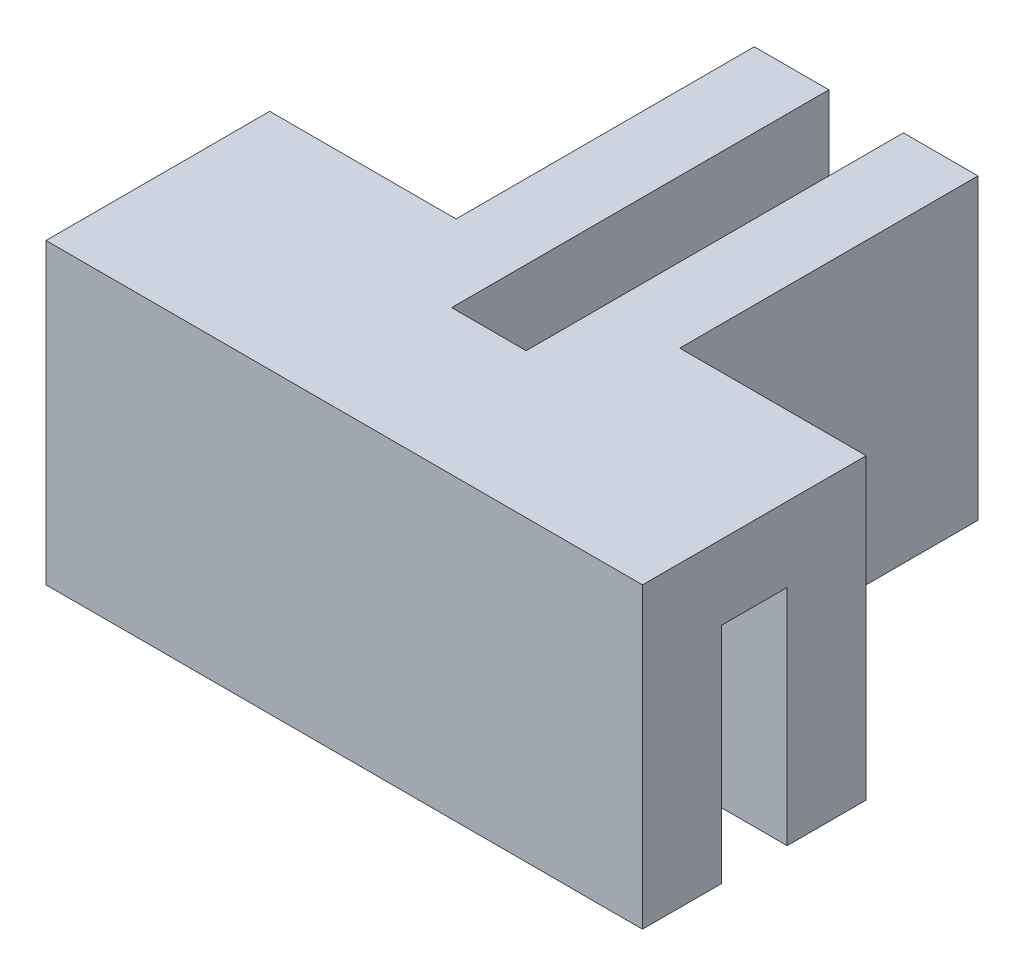
ISO-10303-21;
HEADER;
FILE_DESCRIPTION(('STEP AP214'),'2;1');
FILE_NAME('part.step','',(''),(''),'','','');
FILE_SCHEMA(('AUTOMOTIVE_DESIGN { 1 0 10303 214 1 1 1 1 }'));
ENDSEC;
DATA;
#1=APPLICATION_CONTEXT('core data for automotive mechanical design processes');
#2=APPLICATION_PROTOCOL_DEFINITION('international standard','automotive_design',2000,#1);
#3=PRODUCT_CONTEXT('',#1,'mechanical');
#4=PRODUCT('Part','Part','',(#3));
#5=PRODUCT_RELATED_PRODUCT_CATEGORY('part','',(#4));
#6=PRODUCT_DEFINITION_FORMATION('','',#4);
#7=PRODUCT_DEFINITION_CONTEXT('part definition',#1,'design');
#8=PRODUCT_DEFINITION('design','',#6,#7);
#9=PRODUCT_DEFINITION_SHAPE('','',#8);
#10=(LENGTH_UNIT() NAMED_UNIT(*) SI_UNIT(.MILLI.,.METRE.));
#11=(NAMED_UNIT(*) PLANE_ANGLE_UNIT() SI_UNIT($,.RADIAN.));
#12=(NAMED_UNIT(*) SI_UNIT($,.STERADIAN.) SOLID_ANGLE_UNIT());
#13=UNCERTAINTY_MEASURE_WITH_UNIT(LENGTH_MEASURE(1.E-05),#10,'distance_accuracy_value','');
#14=(GEOMETRIC_REPRESENTATION_CONTEXT(3) GLOBAL_UNCERTAINTY_ASSIGNED_CONTEXT((#13)) GLOBAL_UNIT_ASSIGNED_CONTEXT((#10,
#11,#12)) REPRESENTATION_CONTEXT('',''));
#15=CARTESIAN_POINT('',(0.,0.,0.));
#16=DIRECTION('',(0.,0.,1.));
#17=DIRECTION('',(1.,0.,0.));
#18=AXIS2_PLACEMENT_3D('',#15,#16,#17);
#19=CARTESIAN_POINT('',(0.,12.7,3.3655));
#20=DIRECTION('',(0.,0.,-1.));
#21=DIRECTION('',(-1.,0.,0.));
#22=AXIS2_PLACEMENT_3D('',#19,#20,#21);
#23=PLANE('',#22);
#24=DIRECTION('',(0.,-1.,0.));
#25=VECTOR('',#24,1.);
#26=CARTESIAN_POINT('',(1.5875,12.7,3.3655));
#27=LINE('',#26,#25);
#28=CARTESIAN_POINT('',(1.5875,12.7,3.3655));
#29=VERTEX_POINT('',#28);
#30=CARTESIAN_POINT('',(1.5875,9.525,3.3655));
#31=VERTEX_POINT('',#30);
#32=EDGE_CURVE('E234',#29,#31,#27,.T.);
#33=ORIENTED_EDGE('',*,*,#32,.T.);
#34=DIRECTION('',(1.,0.,0.));
#35=VECTOR('',#34,1.);
#36=CARTESIAN_POINT('',(-12.7,9.525,3.3655));
#37=LINE('',#36,#35);
#38=CARTESIAN_POINT('',(-1.5875,9.525,3.3655));
#39=VERTEX_POINT('',#38);
#40=EDGE_CURVE('E395',#39,#31,#37,.T.);
#41=ORIENTED_EDGE('',*,*,#40,.F.);
#42=DIRECTION('',(0.,-1.,0.));
#43=VECTOR('',#42,1.);
#44=CARTESIAN_POINT('',(-1.5875,12.7,3.3655));
#45=LINE('',#44,#43);
#46=CARTESIAN_POINT('',(-1.5875,12.7,3.3655));
#47=VERTEX_POINT('',#46);
#48=EDGE_CURVE('E230',#47,#39,#45,.T.);
#49=ORIENTED_EDGE('',*,*,#48,.F.);
#50=DIRECTION('',(1.,0.,0.));
#51=VECTOR('',#50,1.);
#52=CARTESIAN_POINT('',(0.,12.7,3.3655));
#53=LINE('',#52,#51);
#54=EDGE_CURVE('E343',#47,#29,#53,.T.);
#55=ORIENTED_EDGE('',*,*,#54,.T.);
#56=EDGE_LOOP('',(#33,#41,#49,#55));
#57=FACE_BOUND('',#56,.T.);
#58=ADVANCED_FACE('F41',(#57),#23,.T.);
#59=CARTESIAN_POINT('',(0.,0.,0.));
#60=DIRECTION('',(0.,1.,0.));
#61=DIRECTION('',(0.,0.,1.));
#62=AXIS2_PLACEMENT_3D('',#59,#60,#61);
#63=PLANE('',#62);
#64=DIRECTION('',(0.,0.,1.));
#65=VECTOR('',#64,1.);
#66=CARTESIAN_POINT('',(-12.7,0.,0.));
#67=LINE('',#66,#65);
#68=CARTESIAN_POINT('',(-12.7,0.,6.1595));
#69=VERTEX_POINT('',#68);
#70=CARTESIAN_POINT('',(-12.7,0.,9.525));
#71=VERTEX_POINT('',#70);
#72=EDGE_CURVE('E158',#69,#71,#67,.T.);
#73=ORIENTED_EDGE('',*,*,#72,.F.);
#74=DIRECTION('',(-1.,0.,0.));
#75=VECTOR('',#74,1.);
#76=CARTESIAN_POINT('',(-12.7,0.,6.1595));
#77=LINE('',#76,#75);
#78=CARTESIAN_POINT('',(12.7,0.,6.1595));
#79=VERTEX_POINT('',#78);
#80=EDGE_CURVE('E368',#79,#69,#77,.T.);
#81=ORIENTED_EDGE('',*,*,#80,.F.);
#82=DIRECTION('',(0.,0.,1.));
#83=VECTOR('',#82,1.);
#84=CARTESIAN_POINT('',(12.7,0.,0.));
#85=LINE('',#84,#83);
#86=CARTESIAN_POINT('',(12.7,0.,9.525));
#87=VERTEX_POINT('',#86);
#88=EDGE_CURVE('E209',#79,#87,#85,.T.);
#89=ORIENTED_EDGE('',*,*,#88,.T.);
#90=DIRECTION('',(1.,0.,0.));
#91=VECTOR('',#90,1.);
#92=CARTESIAN_POINT('',(0.,0.,9.525));
#93=LINE('',#92,#91);
#94=EDGE_CURVE('E206',#71,#87,#93,.T.);
#95=ORIENTED_EDGE('',*,*,#94,.F.);
#96=EDGE_LOOP('',(#73,#81,#89,#95));
#97=FACE_BOUND('',#96,.T.);
#98=ADVANCED_FACE('F263',(#97),#63,.F.);
#99=CARTESIAN_POINT('',(12.7,0.,0.));
#100=VERTEX_POINT('',#99);
#101=CARTESIAN_POINT('',(12.7,0.,3.36550000000001));
#102=VERTEX_POINT('',#101);
#103=EDGE_CURVE('E210',#100,#102,#85,.T.);
#104=ORIENTED_EDGE('',*,*,#103,.T.);
#105=DIRECTION('',(-1.,0.,0.));
#106=VECTOR('',#105,1.);
#107=CARTESIAN_POINT('',(0.,0.,3.3655));
#108=LINE('',#107,#106);
#109=CARTESIAN_POINT('',(1.5875,0.,3.3655));
#110=VERTEX_POINT('',#109);
#111=EDGE_CURVE('E11',#102,#110,#108,.T.);
#112=ORIENTED_EDGE('',*,*,#111,.T.);
#113=DIRECTION('',(0.,0.,1.));
#114=VECTOR('',#113,1.);
#115=CARTESIAN_POINT('',(1.5875,0.,0.));
#116=LINE('',#115,#114);
#117=CARTESIAN_POINT('',(1.5875,0.,-12.7));
#118=VERTEX_POINT('',#117);
#119=EDGE_CURVE('E186',#118,#110,#116,.T.);
#120=ORIENTED_EDGE('',*,*,#119,.F.);
#121=DIRECTION('',(-1.,0.,0.));
#122=VECTOR('',#121,1.);
#123=CARTESIAN_POINT('',(0.,0.,-12.7));
#124=LINE('',#123,#122);
#125=CARTESIAN_POINT('',(4.7625,0.,-12.7));
#126=VERTEX_POINT('',#125);
#127=EDGE_CURVE('E183',#126,#118,#124,.T.);
#128=ORIENTED_EDGE('',*,*,#127,.F.);
#129=DIRECTION('',(0.,0.,-1.));
#130=VECTOR('',#129,1.);
#131=CARTESIAN_POINT('',(4.7625,0.,0.));
#132=LINE('',#131,#130);
#133=CARTESIAN_POINT('',(4.7625,0.,0.));
#134=VERTEX_POINT('',#133);
#135=EDGE_CURVE('E178',#134,#126,#132,.T.);
#136=ORIENTED_EDGE('',*,*,#135,.F.);
#137=DIRECTION('',(1.,0.,0.));
#138=VECTOR('',#137,1.);
#139=CARTESIAN_POINT('',(0.,0.,0.));
#140=LINE('',#139,#138);
#141=EDGE_CURVE('E175',#134,#100,#140,.T.);
#142=ORIENTED_EDGE('',*,*,#141,.T.);
#143=EDGE_LOOP('',(#104,#112,#120,#128,#136,#142));
#144=FACE_BOUND('',#143,.T.);
#145=ADVANCED_FACE('F252',(#144),#63,.F.);
#146=CARTESIAN_POINT('',(0.,12.7,0.));
#147=DIRECTION('',(0.,0.,-1.));
#148=DIRECTION('',(-1.,0.,0.));
#149=AXIS2_PLACEMENT_3D('',#146,#147,#148);
#150=PLANE('',#149);
#151=ORIENTED_EDGE('',*,*,#141,.F.);
#152=DIRECTION('',(0.,-1.,0.));
#153=VECTOR('',#152,1.);
#154=CARTESIAN_POINT('',(4.7625,12.7,0.));
#155=LINE('',#154,#153);
#156=CARTESIAN_POINT('',(4.7625,12.7,0.));
#157=VERTEX_POINT('',#156);
#158=EDGE_CURVE('E50',#157,#134,#155,.T.);
#159=ORIENTED_EDGE('',*,*,#158,.F.);
#160=DIRECTION('',(1.,0.,0.));
#161=VECTOR('',#160,1.);
#162=CARTESIAN_POINT('',(0.,12.7,0.));
#163=LINE('',#162,#161);
#164=CARTESIAN_POINT('',(12.7,12.7,0.));
#165=VERTEX_POINT('',#164);
#166=EDGE_CURVE('E214',#157,#165,#163,.T.);
#167=ORIENTED_EDGE('',*,*,#166,.T.);
#168=DIRECTION('',(0.,-1.,0.));
#169=VECTOR('',#168,1.);
#170=CARTESIAN_POINT('',(12.7,12.7,0.));
#171=LINE('',#170,#169);
#172=EDGE_CURVE('E66',#165,#100,#171,.T.);
#173=ORIENTED_EDGE('',*,*,#172,.T.);
#174=EDGE_LOOP('',(#151,#159,#167,#173));
#175=FACE_BOUND('',#174,.T.);
#176=ADVANCED_FACE('F254',(#175),#150,.T.);
#177=CARTESIAN_POINT('',(4.7625,12.7,0.));
#178=DIRECTION('',(-1.,0.,0.));
#179=DIRECTION('',(0.,0.,1.));
#180=AXIS2_PLACEMENT_3D('',#177,#178,#179);
#181=PLANE('',#180);
#182=ORIENTED_EDGE('',*,*,#135,.T.);
#183=DIRECTION('',(0.,-1.,0.));
#184=VECTOR('',#183,1.);
#185=CARTESIAN_POINT('',(4.7625,12.7,-12.7));
#186=LINE('',#185,#184);
#187=CARTESIAN_POINT('',(4.7625,12.7,-12.7));
#188=VERTEX_POINT('',#187);
#189=EDGE_CURVE('E242',#188,#126,#186,.T.);
#190=ORIENTED_EDGE('',*,*,#189,.F.);
#191=DIRECTION('',(0.,0.,-1.));
#192=VECTOR('',#191,1.);
#193=CARTESIAN_POINT('',(4.7625,12.7,0.));
#194=LINE('',#193,#192);
#195=EDGE_CURVE('E249',#157,#188,#194,.T.);
#196=ORIENTED_EDGE('',*,*,#195,.F.);
#197=ORIENTED_EDGE('',*,*,#158,.T.);
#198=EDGE_LOOP('',(#182,#190,#196,#197));
#199=FACE_BOUND('',#198,.T.);
#200=ADVANCED_FACE('F43',(#199),#181,.F.);
#201=CARTESIAN_POINT('',(0.,12.7,-12.7));
#202=DIRECTION('',(0.,0.,1.));
#203=DIRECTION('',(1.,0.,0.));
#204=AXIS2_PLACEMENT_3D('',#201,#202,#203);
#205=PLANE('',#204);
#206=ORIENTED_EDGE('',*,*,#127,.T.);
#207=DIRECTION('',(0.,-1.,0.));
#208=VECTOR('',#207,1.);
#209=CARTESIAN_POINT('',(1.5875,12.7,-12.7));
#210=LINE('',#209,#208);
#211=CARTESIAN_POINT('',(1.5875,12.7,-12.7));
#212=VERTEX_POINT('',#211);
#213=EDGE_CURVE('E238',#212,#118,#210,.T.);
#214=ORIENTED_EDGE('',*,*,#213,.F.);
#215=DIRECTION('',(-1.,0.,0.));
#216=VECTOR('',#215,1.);
#217=CARTESIAN_POINT('',(0.,12.7,-12.7));
#218=LINE('',#217,#216);
#219=EDGE_CURVE('E338',#188,#212,#218,.T.);
#220=ORIENTED_EDGE('',*,*,#219,.F.);
#221=ORIENTED_EDGE('',*,*,#189,.T.);
#222=EDGE_LOOP('',(#206,#214,#220,#221));
#223=FACE_BOUND('',#222,.T.);
#224=ADVANCED_FACE('F262',(#223),#205,.F.);
#225=CARTESIAN_POINT('',(1.5875,12.7,0.));
#226=DIRECTION('',(1.,0.,0.));
#227=DIRECTION('',(0.,0.,-1.));
#228=AXIS2_PLACEMENT_3D('',#225,#226,#227);
#229=PLANE('',#228);
#230=ORIENTED_EDGE('',*,*,#119,.T.);
#231=DIRECTION('',(0.,1.,0.));
#232=VECTOR('',#231,1.);
#233=CARTESIAN_POINT('',(1.5875,12.7,3.3655));
#234=LINE('',#233,#232);
#235=EDGE_CURVE('E179',#110,#31,#234,.T.);
#236=ORIENTED_EDGE('',*,*,#235,.T.);
#237=ORIENTED_EDGE('',*,*,#32,.F.);
#238=DIRECTION('',(0.,0.,1.));
#239=VECTOR('',#238,1.);
#240=CARTESIAN_POINT('',(1.5875,12.7,0.));
#241=LINE('',#240,#239);
#242=EDGE_CURVE('E295',#212,#29,#241,.T.);
#243=ORIENTED_EDGE('',*,*,#242,.F.);
#244=ORIENTED_EDGE('',*,*,#213,.T.);
#245=EDGE_LOOP('',(#230,#236,#237,#243,#244));
#246=FACE_BOUND('',#245,.T.);
#247=ADVANCED_FACE('F282',(#246),#229,.F.);
#248=CARTESIAN_POINT('',(-1.5875,12.7,0.));
#249=DIRECTION('',(1.,0.,0.));
#250=DIRECTION('',(0.,0.,-1.));
#251=AXIS2_PLACEMENT_3D('',#248,#249,#250);
#252=PLANE('',#251);
#253=DIRECTION('',(0.,0.,1.));
#254=VECTOR('',#253,1.);
#255=CARTESIAN_POINT('',(-1.5875,0.,0.));
#256=LINE('',#255,#254);
#257=CARTESIAN_POINT('',(-1.5875,0.,-12.7));
#258=VERTEX_POINT('',#257);
#259=CARTESIAN_POINT('',(-1.5875,0.,3.3655));
#260=VERTEX_POINT('',#259);
#261=EDGE_CURVE('E190',#258,#260,#256,.T.);
#262=ORIENTED_EDGE('',*,*,#261,.F.);
#263=DIRECTION('',(0.,-1.,0.));
#264=VECTOR('',#263,1.);
#265=CARTESIAN_POINT('',(-1.5875,12.7,-12.7));
#266=LINE('',#265,#264);
#267=CARTESIAN_POINT('',(-1.5875,12.7,-12.7));
#268=VERTEX_POINT('',#267);
#269=EDGE_CURVE('E227',#268,#258,#266,.T.);
#270=ORIENTED_EDGE('',*,*,#269,.F.);
#271=DIRECTION('',(0.,0.,1.));
#272=VECTOR('',#271,1.);
#273=CARTESIAN_POINT('',(-1.5875,12.7,0.));
#274=LINE('',#273,#272);
#275=EDGE_CURVE('E347',#268,#47,#274,.T.);
#276=ORIENTED_EDGE('',*,*,#275,.T.);
#277=ORIENTED_EDGE('',*,*,#48,.T.);
#278=DIRECTION('',(0.,1.,0.));
#279=VECTOR('',#278,1.);
#280=CARTESIAN_POINT('',(-1.5875,12.7,3.3655));
#281=LINE('',#280,#279);
#282=EDGE_CURVE('E328',#260,#39,#281,.T.);
#283=ORIENTED_EDGE('',*,*,#282,.F.);
#284=EDGE_LOOP('',(#262,#270,#276,#277,#283));
#285=FACE_BOUND('',#284,.T.);
#286=ADVANCED_FACE('F280',(#285),#252,.T.);
#287=CARTESIAN_POINT('',(0.,12.7,-12.7));
#288=DIRECTION('',(0.,0.,-1.));
#289=DIRECTION('',(-1.,0.,0.));
#290=AXIS2_PLACEMENT_3D('',#287,#288,#289);
#291=PLANE('',#290);
#292=DIRECTION('',(1.,0.,0.));
#293=VECTOR('',#292,1.);
#294=CARTESIAN_POINT('',(0.,0.,-12.7));
#295=LINE('',#294,#293);
#296=CARTESIAN_POINT('',(-4.7625,0.,-12.7));
#297=VERTEX_POINT('',#296);
#298=EDGE_CURVE('E194',#297,#258,#295,.T.);
#299=ORIENTED_EDGE('',*,*,#298,.F.);
#300=DIRECTION('',(0.,-1.,0.));
#301=VECTOR('',#300,1.);
#302=CARTESIAN_POINT('',(-4.7625,12.7,-12.7));
#303=LINE('',#302,#301);
#304=CARTESIAN_POINT('',(-4.7625,12.7,-12.7));
#305=VERTEX_POINT('',#304);
#306=EDGE_CURVE('E224',#305,#297,#303,.T.);
#307=ORIENTED_EDGE('',*,*,#306,.F.);
#308=DIRECTION('',(1.,0.,0.));
#309=VECTOR('',#308,1.);
#310=CARTESIAN_POINT('',(0.,12.7,-12.7));
#311=LINE('',#310,#309);
#312=EDGE_CURVE('E351',#305,#268,#311,.T.);
#313=ORIENTED_EDGE('',*,*,#312,.T.);
#314=ORIENTED_EDGE('',*,*,#269,.T.);
#315=EDGE_LOOP('',(#299,#307,#313,#314));
#316=FACE_BOUND('',#315,.T.);
#317=ADVANCED_FACE('F514',(#316),#291,.T.);
#318=CARTESIAN_POINT('',(-4.7625,12.7,0.));
#319=DIRECTION('',(-1.,0.,0.));
#320=DIRECTION('',(0.,0.,1.));
#321=AXIS2_PLACEMENT_3D('',#318,#319,#320);
#322=PLANE('',#321);
#323=DIRECTION('',(0.,0.,-1.));
#324=VECTOR('',#323,1.);
#325=CARTESIAN_POINT('',(-4.7625,0.,0.));
#326=LINE('',#325,#324);
#327=CARTESIAN_POINT('',(-4.7625,0.,0.));
#328=VERTEX_POINT('',#327);
#329=EDGE_CURVE('E198',#328,#297,#326,.T.);
#330=ORIENTED_EDGE('',*,*,#329,.F.);
#331=DIRECTION('',(0.,-1.,0.));
#332=VECTOR('',#331,1.);
#333=CARTESIAN_POINT('',(-4.7625,12.7,0.));
#334=LINE('',#333,#332);
#335=CARTESIAN_POINT('',(-4.7625,12.7,0.));
#336=VERTEX_POINT('',#335);
#337=EDGE_CURVE('E221',#336,#328,#334,.T.);
#338=ORIENTED_EDGE('',*,*,#337,.F.);
#339=DIRECTION('',(0.,0.,-1.));
#340=VECTOR('',#339,1.);
#341=CARTESIAN_POINT('',(-4.7625,12.7,0.));
#342=LINE('',#341,#340);
#343=EDGE_CURVE('E354',#336,#305,#342,.T.);
#344=ORIENTED_EDGE('',*,*,#343,.T.);
#345=ORIENTED_EDGE('',*,*,#306,.T.);
#346=EDGE_LOOP('',(#330,#338,#344,#345));
#347=FACE_BOUND('',#346,.T.);
#348=ADVANCED_FACE('F269',(#347),#322,.T.);
#349=CARTESIAN_POINT('',(-12.7,0.,0.));
#350=VERTEX_POINT('',#349);
#351=EDGE_CURVE('E180',#350,#328,#140,.T.);
#352=ORIENTED_EDGE('',*,*,#351,.F.);
#353=DIRECTION('',(0.,-1.,0.));
#354=VECTOR('',#353,1.);
#355=CARTESIAN_POINT('',(-12.7,12.7,0.));
#356=LINE('',#355,#354);
#357=CARTESIAN_POINT('',(-12.7,12.7,0.));
#358=VERTEX_POINT('',#357);
#359=EDGE_CURVE('E163',#358,#350,#356,.T.);
#360=ORIENTED_EDGE('',*,*,#359,.F.);
#361=EDGE_CURVE('E148',#358,#336,#163,.T.);
#362=ORIENTED_EDGE('',*,*,#361,.T.);
#363=ORIENTED_EDGE('',*,*,#337,.T.);
#364=EDGE_LOOP('',(#352,#360,#362,#363));
#365=FACE_BOUND('',#364,.T.);
#366=ADVANCED_FACE('F257',(#365),#150,.T.);
#367=CARTESIAN_POINT('',(-12.7,12.7,0.));
#368=DIRECTION('',(1.,0.,0.));
#369=DIRECTION('',(0.,0.,-1.));
#370=AXIS2_PLACEMENT_3D('',#367,#368,#369);
#371=PLANE('',#370);
#372=DIRECTION('',(0.,0.,-1.));
#373=VECTOR('',#372,1.);
#374=CARTESIAN_POINT('',(-12.7,9.525,6.1595));
#375=LINE('',#374,#373);
#376=CARTESIAN_POINT('',(-12.7,9.525,6.1595));
#377=VERTEX_POINT('',#376);
#378=CARTESIAN_POINT('',(-12.7,9.525,3.3655));
#379=VERTEX_POINT('',#378);
#380=EDGE_CURVE('E372',#377,#379,#375,.T.);
#381=ORIENTED_EDGE('',*,*,#380,.F.);
#382=DIRECTION('',(0.,-1.,0.));
#383=VECTOR('',#382,1.);
#384=CARTESIAN_POINT('',(-12.7,9.525,6.1595));
#385=LINE('',#384,#383);
#386=EDGE_CURVE('E322',#377,#69,#385,.T.);
#387=ORIENTED_EDGE('',*,*,#386,.T.);
#388=ORIENTED_EDGE('',*,*,#72,.T.);
#389=DIRECTION('',(0.,-1.,0.));
#390=VECTOR('',#389,1.);
#391=CARTESIAN_POINT('',(-12.7,12.7,9.525));
#392=LINE('',#391,#390);
#393=CARTESIAN_POINT('',(-12.7,12.7,9.525));
#394=VERTEX_POINT('',#393);
#395=EDGE_CURVE('E153',#394,#71,#392,.T.);
#396=ORIENTED_EDGE('',*,*,#395,.F.);
#397=DIRECTION('',(0.,0.,1.));
#398=VECTOR('',#397,1.);
#399=CARTESIAN_POINT('',(-12.7,12.7,0.));
#400=LINE('',#399,#398);
#401=EDGE_CURVE('E138',#358,#394,#400,.T.);
#402=ORIENTED_EDGE('',*,*,#401,.F.);
#403=ORIENTED_EDGE('',*,*,#359,.T.);
#404=CARTESIAN_POINT('',(-12.7,0.,3.3655));
#405=VERTEX_POINT('',#404);
#406=EDGE_CURVE('E202',#350,#405,#67,.T.);
#407=ORIENTED_EDGE('',*,*,#406,.T.);
#408=DIRECTION('',(0.,-1.,0.));
#409=VECTOR('',#408,1.);
#410=CARTESIAN_POINT('',(-12.7,9.525,3.3655));
#411=LINE('',#410,#409);
#412=EDGE_CURVE('E57',#379,#405,#411,.T.);
#413=ORIENTED_EDGE('',*,*,#412,.F.);
#414=EDGE_LOOP('',(#381,#387,#388,#396,#402,#403,#407,#413));
#415=FACE_BOUND('',#414,.T.);
#416=ADVANCED_FACE('F155',(#415),#371,.F.);
#417=CARTESIAN_POINT('',(0.,12.7,9.525));
#418=DIRECTION('',(0.,0.,-1.));
#419=DIRECTION('',(-1.,0.,0.));
#420=AXIS2_PLACEMENT_3D('',#417,#418,#419);
#421=PLANE('',#420);
#422=ORIENTED_EDGE('',*,*,#94,.T.);
#423=DIRECTION('',(0.,-1.,0.));
#424=VECTOR('',#423,1.);
#425=CARTESIAN_POINT('',(12.7,12.7,9.525));
#426=LINE('',#425,#424);
#427=CARTESIAN_POINT('',(12.7,12.7,9.525));
#428=VERTEX_POINT('',#427);
#429=EDGE_CURVE('E164',#428,#87,#426,.T.);
#430=ORIENTED_EDGE('',*,*,#429,.F.);
#431=DIRECTION('',(1.,0.,0.));
#432=VECTOR('',#431,1.);
#433=CARTESIAN_POINT('',(0.,12.7,9.525));
#434=LINE('',#433,#432);
#435=EDGE_CURVE('E144',#394,#428,#434,.T.);
#436=ORIENTED_EDGE('',*,*,#435,.F.);
#437=ORIENTED_EDGE('',*,*,#395,.T.);
#438=EDGE_LOOP('',(#422,#430,#436,#437));
#439=FACE_BOUND('',#438,.T.);
#440=ADVANCED_FACE('F166',(#439),#421,.F.);
#441=CARTESIAN_POINT('',(12.7,12.7,0.));
#442=DIRECTION('',(1.,0.,0.));
#443=DIRECTION('',(0.,0.,-1.));
#444=AXIS2_PLACEMENT_3D('',#441,#442,#443);
#445=PLANE('',#444);
#446=DIRECTION('',(0.,-1.,0.));
#447=VECTOR('',#446,1.);
#448=CARTESIAN_POINT('',(12.7,9.525,6.1595));
#449=LINE('',#448,#447);
#450=CARTESIAN_POINT('',(12.7,9.525,6.1595));
#451=VERTEX_POINT('',#450);
#452=EDGE_CURVE('E317',#451,#79,#449,.T.);
#453=ORIENTED_EDGE('',*,*,#452,.F.);
#454=DIRECTION('',(0.,0.,1.));
#455=VECTOR('',#454,1.);
#456=CARTESIAN_POINT('',(12.7,9.525,6.1595));
#457=LINE('',#456,#455);
#458=CARTESIAN_POINT('',(12.7,9.525,3.36550000000001));
#459=VERTEX_POINT('',#458);
#460=EDGE_CURVE('E315',#459,#451,#457,.T.);
#461=ORIENTED_EDGE('',*,*,#460,.F.);
#462=DIRECTION('',(0.,-1.,0.));
#463=VECTOR('',#462,1.);
#464=CARTESIAN_POINT('',(12.7,9.525,3.36550000000001));
#465=LINE('',#464,#463);
#466=EDGE_CURVE('E308',#459,#102,#465,.T.);
#467=ORIENTED_EDGE('',*,*,#466,.T.);
#468=ORIENTED_EDGE('',*,*,#103,.F.);
#469=ORIENTED_EDGE('',*,*,#172,.F.);
#470=DIRECTION('',(0.,0.,1.));
#471=VECTOR('',#470,1.);
#472=CARTESIAN_POINT('',(12.7,12.7,0.));
#473=LINE('',#472,#471);
#474=EDGE_CURVE('E169',#165,#428,#473,.T.);
#475=ORIENTED_EDGE('',*,*,#474,.T.);
#476=ORIENTED_EDGE('',*,*,#429,.T.);
#477=ORIENTED_EDGE('',*,*,#88,.F.);
#478=EDGE_LOOP('',(#453,#461,#467,#468,#469,#475,#476,#477));
#479=FACE_BOUND('',#478,.T.);
#480=ADVANCED_FACE('F313',(#479),#445,.T.);
#481=CARTESIAN_POINT('',(0.,12.7,0.));
#482=DIRECTION('',(0.,1.,0.));
#483=DIRECTION('',(0.,0.,1.));
#484=AXIS2_PLACEMENT_3D('',#481,#482,#483);
#485=PLANE('',#484);
#486=ORIENTED_EDGE('',*,*,#166,.F.);
#487=ORIENTED_EDGE('',*,*,#195,.T.);
#488=ORIENTED_EDGE('',*,*,#219,.T.);
#489=ORIENTED_EDGE('',*,*,#242,.T.);
#490=ORIENTED_EDGE('',*,*,#54,.F.);
#491=ORIENTED_EDGE('',*,*,#275,.F.);
#492=ORIENTED_EDGE('',*,*,#312,.F.);
#493=ORIENTED_EDGE('',*,*,#343,.F.);
#494=ORIENTED_EDGE('',*,*,#361,.F.);
#495=ORIENTED_EDGE('',*,*,#401,.T.);
#496=ORIENTED_EDGE('',*,*,#435,.T.);
#497=ORIENTED_EDGE('',*,*,#474,.F.);
#498=EDGE_LOOP('',(#486,#487,#488,#489,#490,#491,#492,#493,#494,#495,#496,#497));
#499=FACE_BOUND('',#498,.T.);
#500=ADVANCED_FACE('F141',(#499),#485,.T.);
#501=ORIENTED_EDGE('',*,*,#261,.T.);
#502=DIRECTION('',(1.,0.,0.));
#503=VECTOR('',#502,1.);
#504=CARTESIAN_POINT('',(-12.7,0.,3.3655));
#505=LINE('',#504,#503);
#506=EDGE_CURVE('E364',#405,#260,#505,.T.);
#507=ORIENTED_EDGE('',*,*,#506,.F.);
#508=ORIENTED_EDGE('',*,*,#406,.F.);
#509=ORIENTED_EDGE('',*,*,#351,.T.);
#510=ORIENTED_EDGE('',*,*,#329,.T.);
#511=ORIENTED_EDGE('',*,*,#298,.T.);
#512=EDGE_LOOP('',(#501,#507,#508,#509,#510,#511));
#513=FACE_BOUND('',#512,.T.);
#514=ADVANCED_FACE('F265',(#513),#63,.F.);
#515=CARTESIAN_POINT('',(-12.7,9.525,3.3655));
#516=DIRECTION('',(0.,0.,-1.));
#517=DIRECTION('',(-1.,0.,0.));
#518=AXIS2_PLACEMENT_3D('',#515,#516,#517);
#519=PLANE('',#518);
#520=ORIENTED_EDGE('',*,*,#111,.F.);
#521=ORIENTED_EDGE('',*,*,#466,.F.);
#522=EDGE_CURVE('E411',#31,#459,#37,.T.);
#523=ORIENTED_EDGE('',*,*,#522,.F.);
#524=ORIENTED_EDGE('',*,*,#235,.F.);
#525=EDGE_LOOP('',(#520,#521,#523,#524));
#526=FACE_BOUND('',#525,.T.);
#527=ADVANCED_FACE('F305',(#526),#519,.F.);
#528=CARTESIAN_POINT('',(-12.7,9.525,6.1595));
#529=DIRECTION('',(0.,0.,1.));
#530=DIRECTION('',(1.,0.,0.));
#531=AXIS2_PLACEMENT_3D('',#528,#529,#530);
#532=PLANE('',#531);
#533=ORIENTED_EDGE('',*,*,#80,.T.);
#534=ORIENTED_EDGE('',*,*,#386,.F.);
#535=DIRECTION('',(-1.,0.,0.));
#536=VECTOR('',#535,1.);
#537=CARTESIAN_POINT('',(-12.7,9.525,6.1595));
#538=LINE('',#537,#536);
#539=EDGE_CURVE('E324',#451,#377,#538,.T.);
#540=ORIENTED_EDGE('',*,*,#539,.F.);
#541=ORIENTED_EDGE('',*,*,#452,.T.);
#542=EDGE_LOOP('',(#533,#534,#540,#541));
#543=FACE_BOUND('',#542,.T.);
#544=ADVANCED_FACE('F418',(#543),#532,.F.);
#545=ORIENTED_EDGE('',*,*,#282,.T.);
#546=EDGE_CURVE('E406',#379,#39,#37,.T.);
#547=ORIENTED_EDGE('',*,*,#546,.F.);
#548=ORIENTED_EDGE('',*,*,#412,.T.);
#549=ORIENTED_EDGE('',*,*,#506,.T.);
#550=EDGE_LOOP('',(#545,#547,#548,#549));
#551=FACE_BOUND('',#550,.T.);
#552=ADVANCED_FACE('F407',(#551),#519,.F.);
#553=CARTESIAN_POINT('',(0.,9.525,0.));
#554=DIRECTION('',(0.,-1.,0.));
#555=DIRECTION('',(0.,0.,-1.));
#556=AXIS2_PLACEMENT_3D('',#553,#554,#555);
#557=PLANE('',#556);
#558=ORIENTED_EDGE('',*,*,#380,.T.);
#559=ORIENTED_EDGE('',*,*,#546,.T.);
#560=ORIENTED_EDGE('',*,*,#40,.T.);
#561=ORIENTED_EDGE('',*,*,#522,.T.);
#562=ORIENTED_EDGE('',*,*,#460,.T.);
#563=ORIENTED_EDGE('',*,*,#539,.T.);
#564=EDGE_LOOP('',(#558,#559,#560,#561,#562,#563));
#565=FACE_BOUND('',#564,.T.);
#566=ADVANCED_FACE('F412',(#565),#557,.T.);
#567=CLOSED_SHELL('',(#58,#98,#145,#176,#200,#224,#247,#286,#317,#348,#366,#416,#440,#480,#500,
#514,#527,#544,#552,#566));
#568=MANIFOLD_SOLID_BREP('B2',#567);
#569=ADVANCED_BREP_SHAPE_REPRESENTATION('',(#18,#568),#14);
#570=SHAPE_DEFINITION_REPRESENTATION(#9,#569);
ENDSEC;
END-ISO-10303-21;
